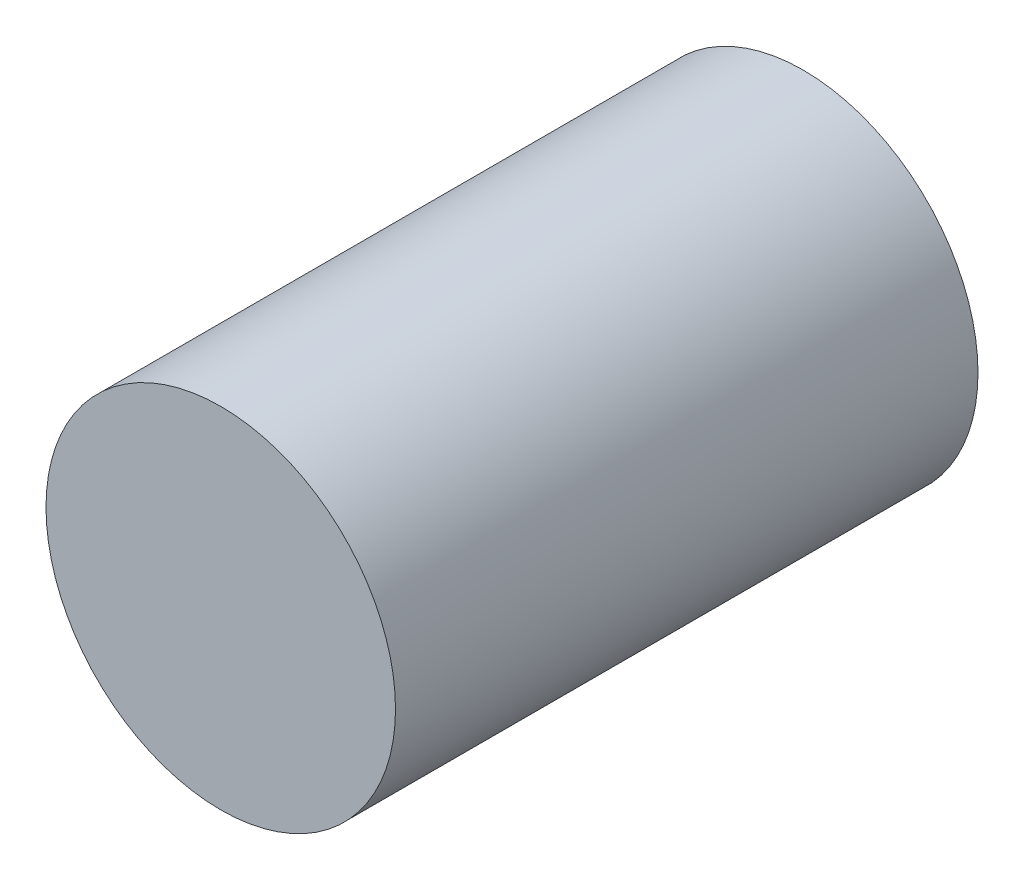
ISO-10303-21;
HEADER;
FILE_DESCRIPTION(('STEP AP214'),'2;1');
FILE_NAME('part.step','',(''),(''),'','','');
FILE_SCHEMA(('AUTOMOTIVE_DESIGN { 1 0 10303 214 1 1 1 1 }'));
ENDSEC;
DATA;
#1=APPLICATION_CONTEXT('core data for automotive mechanical design processes');
#2=APPLICATION_PROTOCOL_DEFINITION('international standard','automotive_design',2000,#1);
#3=PRODUCT_CONTEXT('',#1,'mechanical');
#4=PRODUCT('Part','Part','',(#3));
#5=PRODUCT_RELATED_PRODUCT_CATEGORY('part','',(#4));
#6=PRODUCT_DEFINITION_FORMATION('','',#4);
#7=PRODUCT_DEFINITION_CONTEXT('part definition',#1,'design');
#8=PRODUCT_DEFINITION('design','',#6,#7);
#9=PRODUCT_DEFINITION_SHAPE('','',#8);
#10=(LENGTH_UNIT() NAMED_UNIT(*) SI_UNIT(.MILLI.,.METRE.));
#11=(NAMED_UNIT(*) PLANE_ANGLE_UNIT() SI_UNIT($,.RADIAN.));
#12=(NAMED_UNIT(*) SI_UNIT($,.STERADIAN.) SOLID_ANGLE_UNIT());
#13=UNCERTAINTY_MEASURE_WITH_UNIT(LENGTH_MEASURE(1.E-05),#10,'distance_accuracy_value','');
#14=(GEOMETRIC_REPRESENTATION_CONTEXT(3) GLOBAL_UNCERTAINTY_ASSIGNED_CONTEXT((#13)) GLOBAL_UNIT_ASSIGNED_CONTEXT((#10,
#11,#12)) REPRESENTATION_CONTEXT('',''));
#15=CARTESIAN_POINT('',(0.,0.,0.));
#16=DIRECTION('',(0.,0.,1.));
#17=DIRECTION('',(1.,0.,0.));
#18=AXIS2_PLACEMENT_3D('',#15,#16,#17);
#19=CARTESIAN_POINT('',(0.,0.,5.));
#20=DIRECTION('',(0.,0.,-1.));
#21=DIRECTION('',(-1.,0.,0.));
#22=AXIS2_PLACEMENT_3D('',#19,#20,#21);
#23=CYLINDRICAL_SURFACE('',#22,1.5);
#24=CARTESIAN_POINT('',(0.,0.,5.));
#25=DIRECTION('',(0.,0.,1.));
#26=DIRECTION('',(1.,0.,0.));
#27=AXIS2_PLACEMENT_3D('',#24,#25,#26);
#28=CIRCLE('',#27,1.5);
#29=CARTESIAN_POINT('',(1.5,0.,5.));
#30=VERTEX_POINT('',#29);
#31=EDGE_CURVE('E10',#30,#30,#28,.T.);
#32=ORIENTED_EDGE('',*,*,#31,.F.);
#33=EDGE_LOOP('',(#32));
#34=FACE_BOUND('',#33,.T.);
#35=CARTESIAN_POINT('',(0.,0.,0.));
#36=DIRECTION('',(0.,0.,1.));
#37=DIRECTION('',(1.,0.,0.));
#38=AXIS2_PLACEMENT_3D('',#35,#36,#37);
#39=CIRCLE('',#38,1.5);
#40=CARTESIAN_POINT('',(1.5,0.,0.));
#41=VERTEX_POINT('',#40);
#42=EDGE_CURVE('E34',#41,#41,#39,.T.);
#43=ORIENTED_EDGE('',*,*,#42,.T.);
#44=EDGE_LOOP('',(#43));
#45=FACE_BOUND('',#44,.T.);
#46=ADVANCED_FACE('F31',(#34,#45),#23,.T.);
#47=CARTESIAN_POINT('',(0.,0.,5.));
#48=DIRECTION('',(0.,0.,1.));
#49=DIRECTION('',(1.,0.,0.));
#50=AXIS2_PLACEMENT_3D('',#47,#48,#49);
#51=PLANE('',#50);
#52=ORIENTED_EDGE('',*,*,#31,.T.);
#53=EDGE_LOOP('',(#52));
#54=FACE_BOUND('',#53,.T.);
#55=ADVANCED_FACE('F46',(#54),#51,.T.);
#56=CARTESIAN_POINT('',(0.,0.,0.));
#57=DIRECTION('',(0.,0.,1.));
#58=DIRECTION('',(1.,0.,0.));
#59=AXIS2_PLACEMENT_3D('',#56,#57,#58);
#60=PLANE('',#59);
#61=ORIENTED_EDGE('',*,*,#42,.F.);
#62=EDGE_LOOP('',(#61));
#63=FACE_BOUND('',#62,.T.);
#64=ADVANCED_FACE('F44',(#63),#60,.F.);
#65=CLOSED_SHELL('',(#46,#55,#64));
#66=MANIFOLD_SOLID_BREP('B2',#65);
#67=ADVANCED_BREP_SHAPE_REPRESENTATION('',(#18,#66),#14);
#68=SHAPE_DEFINITION_REPRESENTATION(#9,#67);
ENDSEC;
END-ISO-10303-21;
